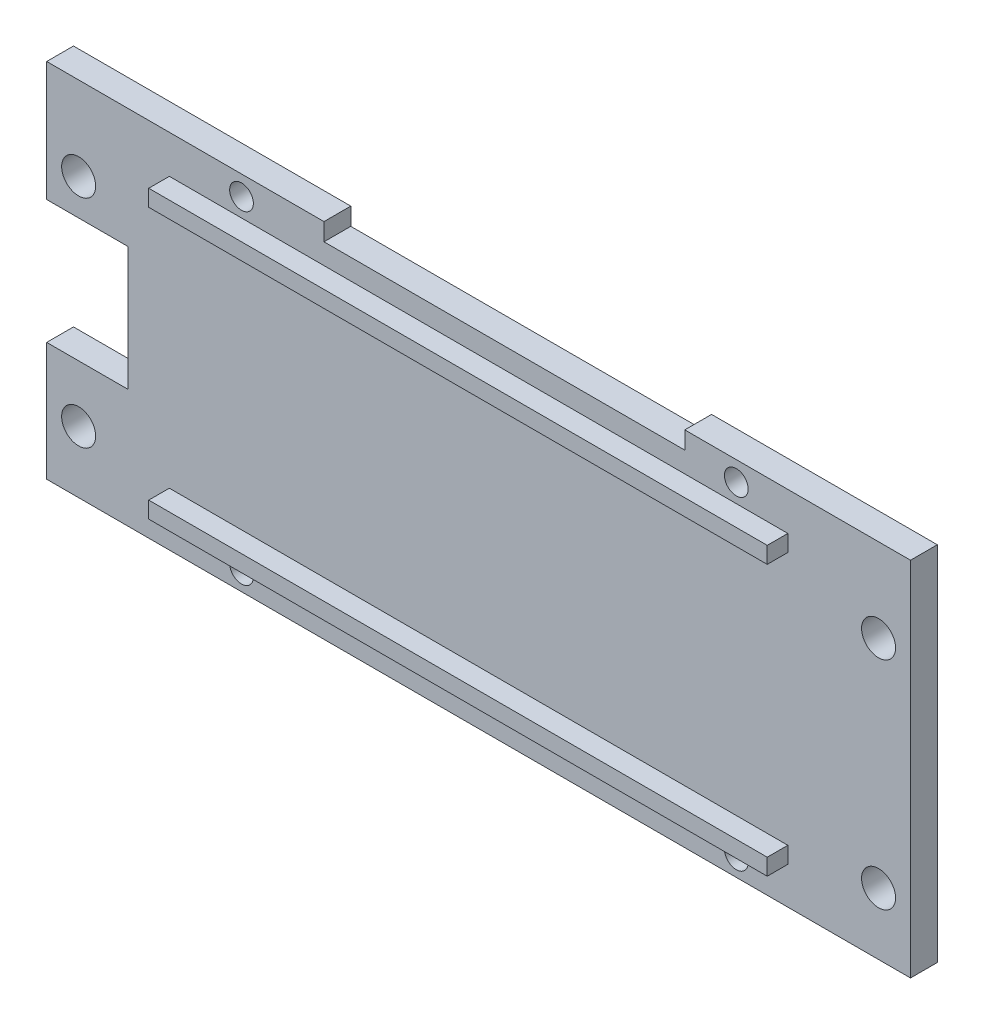
ISO-10303-21;
HEADER;
FILE_DESCRIPTION(('STEP AP214'),'2;1');
FILE_NAME('part.step','',(''),(''),'','','');
FILE_SCHEMA(('AUTOMOTIVE_DESIGN { 1 0 10303 214 1 1 1 1 }'));
ENDSEC;
DATA;
#1=APPLICATION_CONTEXT('core data for automotive mechanical design processes');
#2=APPLICATION_PROTOCOL_DEFINITION('international standard','automotive_design',2000,#1);
#3=PRODUCT_CONTEXT('',#1,'mechanical');
#4=PRODUCT('Part','Part','',(#3));
#5=PRODUCT_RELATED_PRODUCT_CATEGORY('part','',(#4));
#6=PRODUCT_DEFINITION_FORMATION('','',#4);
#7=PRODUCT_DEFINITION_CONTEXT('part definition',#1,'design');
#8=PRODUCT_DEFINITION('design','',#6,#7);
#9=PRODUCT_DEFINITION_SHAPE('','',#8);
#10=(LENGTH_UNIT() NAMED_UNIT(*) SI_UNIT(.MILLI.,.METRE.));
#11=(NAMED_UNIT(*) PLANE_ANGLE_UNIT() SI_UNIT($,.RADIAN.));
#12=(NAMED_UNIT(*) SI_UNIT($,.STERADIAN.) SOLID_ANGLE_UNIT());
#13=UNCERTAINTY_MEASURE_WITH_UNIT(LENGTH_MEASURE(1.E-05),#10,'distance_accuracy_value','');
#14=(GEOMETRIC_REPRESENTATION_CONTEXT(3) GLOBAL_UNCERTAINTY_ASSIGNED_CONTEXT((#13)) GLOBAL_UNIT_ASSIGNED_CONTEXT((#10,
#11,#12)) REPRESENTATION_CONTEXT('',''));
#15=CARTESIAN_POINT('',(0.,0.,0.));
#16=DIRECTION('',(0.,0.,1.));
#17=DIRECTION('',(1.,0.,0.));
#18=AXIS2_PLACEMENT_3D('',#15,#16,#17);
#19=CARTESIAN_POINT('',(0.,0.,2.6));
#20=DIRECTION('',(0.,0.,1.));
#21=DIRECTION('',(1.,0.,0.));
#22=AXIS2_PLACEMENT_3D('',#19,#20,#21);
#23=PLANE('',#22);
#24=CARTESIAN_POINT('',(-23.,8.7,2.6));
#25=DIRECTION('',(0.,0.,1.));
#26=DIRECTION('',(1.,0.,0.));
#27=AXIS2_PLACEMENT_3D('',#24,#25,#26);
#28=CIRCLE('',#27,1.15);
#29=CARTESIAN_POINT('',(-21.85,8.7,2.6));
#30=VERTEX_POINT('',#29);
#31=EDGE_CURVE('E246',#30,#30,#28,.T.);
#32=ORIENTED_EDGE('',*,*,#31,.F.);
#33=EDGE_LOOP('',(#32));
#34=FACE_BOUND('',#33,.T.);
#35=CARTESIAN_POINT('',(-23.,-22.7,2.6));
#36=DIRECTION('',(0.,0.,1.));
#37=DIRECTION('',(1.,0.,0.));
#38=AXIS2_PLACEMENT_3D('',#35,#36,#37);
#39=CIRCLE('',#38,1.15);
#40=CARTESIAN_POINT('',(-21.85,-22.7,2.6));
#41=VERTEX_POINT('',#40);
#42=EDGE_CURVE('E258',#41,#41,#39,.T.);
#43=ORIENTED_EDGE('',*,*,#42,.F.);
#44=EDGE_LOOP('',(#43));
#45=FACE_BOUND('',#44,.T.);
#46=CARTESIAN_POINT('',(-38.8,2.5,2.6));
#47=DIRECTION('',(0.,0.,1.));
#48=DIRECTION('',(1.,0.,0.));
#49=AXIS2_PLACEMENT_3D('',#46,#47,#48);
#50=CIRCLE('',#49,1.65);
#51=CARTESIAN_POINT('',(-37.15,2.5,2.6));
#52=VERTEX_POINT('',#51);
#53=EDGE_CURVE('E270',#52,#52,#50,.T.);
#54=ORIENTED_EDGE('',*,*,#53,.F.);
#55=EDGE_LOOP('',(#54));
#56=FACE_BOUND('',#55,.T.);
#57=CARTESIAN_POINT('',(-38.8,-18.5,2.6));
#58=DIRECTION('',(0.,0.,1.));
#59=DIRECTION('',(1.,0.,0.));
#60=AXIS2_PLACEMENT_3D('',#57,#58,#59);
#61=CIRCLE('',#60,1.65);
#62=CARTESIAN_POINT('',(-37.15,-18.5,2.6));
#63=VERTEX_POINT('',#62);
#64=EDGE_CURVE('E282',#63,#63,#61,.T.);
#65=ORIENTED_EDGE('',*,*,#64,.F.);
#66=EDGE_LOOP('',(#65));
#67=FACE_BOUND('',#66,.T.);
#68=DIRECTION('',(0.,-1.,0.));
#69=VECTOR('',#68,1.);
#70=CARTESIAN_POINT('',(-41.9,-13.,2.6));
#71=LINE('',#70,#69);
#72=CARTESIAN_POINT('',(-41.9,-13.,2.6));
#73=VERTEX_POINT('',#72);
#74=CARTESIAN_POINT('',(-41.9,-24.5,2.6));
#75=VERTEX_POINT('',#74);
#76=EDGE_CURVE('E288',#73,#75,#71,.T.);
#77=ORIENTED_EDGE('',*,*,#76,.T.);
#78=DIRECTION('',(1.,0.,0.));
#79=VECTOR('',#78,1.);
#80=CARTESIAN_POINT('',(-41.9,-24.5,2.6));
#81=LINE('',#80,#79);
#82=CARTESIAN_POINT('',(41.9,-24.5,2.6));
#83=VERTEX_POINT('',#82);
#84=EDGE_CURVE('E291',#75,#83,#81,.T.);
#85=ORIENTED_EDGE('',*,*,#84,.T.);
#86=DIRECTION('',(0.,1.,0.));
#87=VECTOR('',#86,1.);
#88=CARTESIAN_POINT('',(41.9,-24.5,2.6));
#89=LINE('',#88,#87);
#90=CARTESIAN_POINT('',(41.9,10.6,2.6));
#91=VERTEX_POINT('',#90);
#92=EDGE_CURVE('E294',#83,#91,#89,.T.);
#93=ORIENTED_EDGE('',*,*,#92,.T.);
#94=DIRECTION('',(-1.,0.,0.));
#95=VECTOR('',#94,1.);
#96=CARTESIAN_POINT('',(41.9,10.6,2.6));
#97=LINE('',#96,#95);
#98=CARTESIAN_POINT('',(20.,10.6,2.6));
#99=VERTEX_POINT('',#98);
#100=EDGE_CURVE('E296',#91,#99,#97,.T.);
#101=ORIENTED_EDGE('',*,*,#100,.T.);
#102=DIRECTION('',(0.,-1.,0.));
#103=VECTOR('',#102,1.);
#104=CARTESIAN_POINT('',(20.,10.6,2.6));
#105=LINE('',#104,#103);
#106=CARTESIAN_POINT('',(20.,8.9,2.6));
#107=VERTEX_POINT('',#106);
#108=EDGE_CURVE('E298',#99,#107,#105,.T.);
#109=ORIENTED_EDGE('',*,*,#108,.T.);
#110=DIRECTION('',(-1.,0.,0.));
#111=VECTOR('',#110,1.);
#112=CARTESIAN_POINT('',(20.,8.9,2.6));
#113=LINE('',#112,#111);
#114=CARTESIAN_POINT('',(-15.,8.9,2.6));
#115=VERTEX_POINT('',#114);
#116=EDGE_CURVE('E300',#107,#115,#113,.T.);
#117=ORIENTED_EDGE('',*,*,#116,.T.);
#118=DIRECTION('',(0.,1.,0.));
#119=VECTOR('',#118,1.);
#120=CARTESIAN_POINT('',(-15.,8.9,2.6));
#121=LINE('',#120,#119);
#122=CARTESIAN_POINT('',(-15.,10.6,2.6));
#123=VERTEX_POINT('',#122);
#124=EDGE_CURVE('E302',#115,#123,#121,.T.);
#125=ORIENTED_EDGE('',*,*,#124,.T.);
#126=DIRECTION('',(-1.,0.,0.));
#127=VECTOR('',#126,1.);
#128=CARTESIAN_POINT('',(-15.,10.6,2.6));
#129=LINE('',#128,#127);
#130=CARTESIAN_POINT('',(-41.9,10.6,2.6));
#131=VERTEX_POINT('',#130);
#132=EDGE_CURVE('E304',#123,#131,#129,.T.);
#133=ORIENTED_EDGE('',*,*,#132,.T.);
#134=DIRECTION('',(0.,-1.,0.));
#135=VECTOR('',#134,1.);
#136=CARTESIAN_POINT('',(-41.9,10.6,2.6));
#137=LINE('',#136,#135);
#138=CARTESIAN_POINT('',(-41.9,-1.,2.6));
#139=VERTEX_POINT('',#138);
#140=EDGE_CURVE('E306',#131,#139,#137,.T.);
#141=ORIENTED_EDGE('',*,*,#140,.T.);
#142=DIRECTION('',(1.,0.,0.));
#143=VECTOR('',#142,1.);
#144=CARTESIAN_POINT('',(-41.9,-1.,2.6));
#145=LINE('',#144,#143);
#146=CARTESIAN_POINT('',(-34.,-1.,2.6));
#147=VERTEX_POINT('',#146);
#148=EDGE_CURVE('E308',#139,#147,#145,.T.);
#149=ORIENTED_EDGE('',*,*,#148,.T.);
#150=DIRECTION('',(0.,-1.,0.));
#151=VECTOR('',#150,1.);
#152=CARTESIAN_POINT('',(-34.,-1.,2.6));
#153=LINE('',#152,#151);
#154=CARTESIAN_POINT('',(-34.,-13.,2.6));
#155=VERTEX_POINT('',#154);
#156=EDGE_CURVE('E310',#147,#155,#153,.T.);
#157=ORIENTED_EDGE('',*,*,#156,.T.);
#158=DIRECTION('',(-1.,0.,0.));
#159=VECTOR('',#158,1.);
#160=CARTESIAN_POINT('',(-34.,-13.,2.6));
#161=LINE('',#160,#159);
#162=EDGE_CURVE('E312',#155,#73,#161,.T.);
#163=ORIENTED_EDGE('',*,*,#162,.T.);
#164=EDGE_LOOP('',(#77,#85,#93,#101,#109,#117,#125,#133,#141,#149,#157,#163));
#165=FACE_BOUND('',#164,.T.);
#166=CARTESIAN_POINT('',(38.8,-18.5,2.6));
#167=DIRECTION('',(0.,0.,1.));
#168=DIRECTION('',(1.,0.,0.));
#169=AXIS2_PLACEMENT_3D('',#166,#167,#168);
#170=CIRCLE('',#169,1.65);
#171=CARTESIAN_POINT('',(40.45,-18.5,2.6));
#172=VERTEX_POINT('',#171);
#173=EDGE_CURVE('E276',#172,#172,#170,.T.);
#174=ORIENTED_EDGE('',*,*,#173,.F.);
#175=EDGE_LOOP('',(#174));
#176=FACE_BOUND('',#175,.T.);
#177=CARTESIAN_POINT('',(38.8,2.5,2.6));
#178=DIRECTION('',(0.,0.,1.));
#179=DIRECTION('',(1.,0.,0.));
#180=AXIS2_PLACEMENT_3D('',#177,#178,#179);
#181=CIRCLE('',#180,1.65);
#182=CARTESIAN_POINT('',(40.45,2.5,2.6));
#183=VERTEX_POINT('',#182);
#184=EDGE_CURVE('E264',#183,#183,#181,.T.);
#185=ORIENTED_EDGE('',*,*,#184,.F.);
#186=EDGE_LOOP('',(#185));
#187=FACE_BOUND('',#186,.T.);
#188=CARTESIAN_POINT('',(25.,-22.7,2.6));
#189=DIRECTION('',(0.,0.,1.));
#190=DIRECTION('',(1.,0.,0.));
#191=AXIS2_PLACEMENT_3D('',#188,#189,#190);
#192=CIRCLE('',#191,1.15);
#193=CARTESIAN_POINT('',(26.15,-22.7,2.6));
#194=VERTEX_POINT('',#193);
#195=EDGE_CURVE('E252',#194,#194,#192,.T.);
#196=ORIENTED_EDGE('',*,*,#195,.F.);
#197=EDGE_LOOP('',(#196));
#198=FACE_BOUND('',#197,.T.);
#199=CARTESIAN_POINT('',(25.,8.7,2.6));
#200=DIRECTION('',(0.,0.,1.));
#201=DIRECTION('',(1.,0.,0.));
#202=AXIS2_PLACEMENT_3D('',#199,#200,#201);
#203=CIRCLE('',#202,1.15);
#204=CARTESIAN_POINT('',(26.15,8.7,2.6));
#205=VERTEX_POINT('',#204);
#206=EDGE_CURVE('E240',#205,#205,#203,.T.);
#207=ORIENTED_EDGE('',*,*,#206,.F.);
#208=EDGE_LOOP('',(#207));
#209=FACE_BOUND('',#208,.T.);
#210=DIRECTION('',(1.,0.,0.));
#211=VECTOR('',#210,1.);
#212=CARTESIAN_POINT('',(-30.,-20.9,2.6));
#213=LINE('',#212,#211);
#214=CARTESIAN_POINT('',(-30.,-20.9,2.6));
#215=VERTEX_POINT('',#214);
#216=CARTESIAN_POINT('',(30.,-20.9,2.6));
#217=VERTEX_POINT('',#216);
#218=EDGE_CURVE('E205',#215,#217,#213,.T.);
#219=ORIENTED_EDGE('',*,*,#218,.F.);
#220=DIRECTION('',(0.,-1.,0.));
#221=VECTOR('',#220,1.);
#222=CARTESIAN_POINT('',(-30.,-19.3,2.6));
#223=LINE('',#222,#221);
#224=CARTESIAN_POINT('',(-30.,-19.3,2.6));
#225=VERTEX_POINT('',#224);
#226=EDGE_CURVE('E202',#225,#215,#223,.T.);
#227=ORIENTED_EDGE('',*,*,#226,.F.);
#228=DIRECTION('',(-1.,0.,0.));
#229=VECTOR('',#228,1.);
#230=CARTESIAN_POINT('',(30.,-19.3,2.6));
#231=LINE('',#230,#229);
#232=CARTESIAN_POINT('',(30.,-19.3,2.6));
#233=VERTEX_POINT('',#232);
#234=EDGE_CURVE('E220',#233,#225,#231,.T.);
#235=ORIENTED_EDGE('',*,*,#234,.F.);
#236=DIRECTION('',(0.,1.,0.));
#237=VECTOR('',#236,1.);
#238=CARTESIAN_POINT('',(30.,-20.9,2.6));
#239=LINE('',#238,#237);
#240=EDGE_CURVE('E228',#217,#233,#239,.T.);
#241=ORIENTED_EDGE('',*,*,#240,.F.);
#242=EDGE_LOOP('',(#219,#227,#235,#241));
#243=FACE_BOUND('',#242,.T.);
#244=DIRECTION('',(1.,0.,0.));
#245=VECTOR('',#244,1.);
#246=CARTESIAN_POINT('',(-30.,5.3,2.6));
#247=LINE('',#246,#245);
#248=CARTESIAN_POINT('',(-30.,5.3,2.6));
#249=VERTEX_POINT('',#248);
#250=CARTESIAN_POINT('',(30.,5.3,2.6));
#251=VERTEX_POINT('',#250);
#252=EDGE_CURVE('E201',#249,#251,#247,.T.);
#253=ORIENTED_EDGE('',*,*,#252,.F.);
#254=DIRECTION('',(0.,-1.,0.));
#255=VECTOR('',#254,1.);
#256=CARTESIAN_POINT('',(-30.,6.9,2.6));
#257=LINE('',#256,#255);
#258=CARTESIAN_POINT('',(-30.,6.9,2.6));
#259=VERTEX_POINT('',#258);
#260=EDGE_CURVE('E196',#259,#249,#257,.T.);
#261=ORIENTED_EDGE('',*,*,#260,.F.);
#262=DIRECTION('',(-1.,0.,0.));
#263=VECTOR('',#262,1.);
#264=CARTESIAN_POINT('',(30.,6.9,2.6));
#265=LINE('',#264,#263);
#266=CARTESIAN_POINT('',(30.,6.9,2.6));
#267=VERTEX_POINT('',#266);
#268=EDGE_CURVE('E181',#267,#259,#265,.T.);
#269=ORIENTED_EDGE('',*,*,#268,.F.);
#270=DIRECTION('',(0.,1.,0.));
#271=VECTOR('',#270,1.);
#272=CARTESIAN_POINT('',(30.,5.3,2.6));
#273=LINE('',#272,#271);
#274=EDGE_CURVE('E189',#251,#267,#273,.T.);
#275=ORIENTED_EDGE('',*,*,#274,.F.);
#276=EDGE_LOOP('',(#253,#261,#269,#275));
#277=FACE_BOUND('',#276,.T.);
#278=ADVANCED_FACE('F43',(#34,#45,#56,#67,#165,#176,#187,#198,#209,#243,#277),#23,.T.);
#279=CARTESIAN_POINT('',(0.,0.,0.));
#280=DIRECTION('',(0.,0.,1.));
#281=DIRECTION('',(1.,0.,0.));
#282=AXIS2_PLACEMENT_3D('',#279,#280,#281);
#283=PLANE('',#282);
#284=DIRECTION('',(0.,-1.,0.));
#285=VECTOR('',#284,1.);
#286=CARTESIAN_POINT('',(-41.9,-13.,0.));
#287=LINE('',#286,#285);
#288=CARTESIAN_POINT('',(-41.9,-13.,0.));
#289=VERTEX_POINT('',#288);
#290=CARTESIAN_POINT('',(-41.9,-24.5,0.));
#291=VERTEX_POINT('',#290);
#292=EDGE_CURVE('E285',#289,#291,#287,.T.);
#293=ORIENTED_EDGE('',*,*,#292,.F.);
#294=DIRECTION('',(-1.,0.,0.));
#295=VECTOR('',#294,1.);
#296=CARTESIAN_POINT('',(-34.,-13.,0.));
#297=LINE('',#296,#295);
#298=CARTESIAN_POINT('',(-34.,-13.,0.));
#299=VERTEX_POINT('',#298);
#300=EDGE_CURVE('E292',#299,#289,#297,.T.);
#301=ORIENTED_EDGE('',*,*,#300,.F.);
#302=DIRECTION('',(0.,-1.,0.));
#303=VECTOR('',#302,1.);
#304=CARTESIAN_POINT('',(-34.,-1.,0.));
#305=LINE('',#304,#303);
#306=CARTESIAN_POINT('',(-34.,-1.,0.));
#307=VERTEX_POINT('',#306);
#308=EDGE_CURVE('E335',#307,#299,#305,.T.);
#309=ORIENTED_EDGE('',*,*,#308,.F.);
#310=DIRECTION('',(1.,0.,0.));
#311=VECTOR('',#310,1.);
#312=CARTESIAN_POINT('',(-41.9,-1.,0.));
#313=LINE('',#312,#311);
#314=CARTESIAN_POINT('',(-41.9,-1.,0.));
#315=VERTEX_POINT('',#314);
#316=EDGE_CURVE('E333',#315,#307,#313,.T.);
#317=ORIENTED_EDGE('',*,*,#316,.F.);
#318=DIRECTION('',(0.,-1.,0.));
#319=VECTOR('',#318,1.);
#320=CARTESIAN_POINT('',(-41.9,10.6,0.));
#321=LINE('',#320,#319);
#322=CARTESIAN_POINT('',(-41.9,10.6,0.));
#323=VERTEX_POINT('',#322);
#324=EDGE_CURVE('E331',#323,#315,#321,.T.);
#325=ORIENTED_EDGE('',*,*,#324,.F.);
#326=DIRECTION('',(-1.,0.,0.));
#327=VECTOR('',#326,1.);
#328=CARTESIAN_POINT('',(-15.,10.6,0.));
#329=LINE('',#328,#327);
#330=CARTESIAN_POINT('',(-15.,10.6,0.));
#331=VERTEX_POINT('',#330);
#332=EDGE_CURVE('E329',#331,#323,#329,.T.);
#333=ORIENTED_EDGE('',*,*,#332,.F.);
#334=DIRECTION('',(0.,1.,0.));
#335=VECTOR('',#334,1.);
#336=CARTESIAN_POINT('',(-15.,8.9,0.));
#337=LINE('',#336,#335);
#338=CARTESIAN_POINT('',(-15.,8.9,0.));
#339=VERTEX_POINT('',#338);
#340=EDGE_CURVE('E327',#339,#331,#337,.T.);
#341=ORIENTED_EDGE('',*,*,#340,.F.);
#342=DIRECTION('',(-1.,0.,0.));
#343=VECTOR('',#342,1.);
#344=CARTESIAN_POINT('',(20.,8.9,0.));
#345=LINE('',#344,#343);
#346=CARTESIAN_POINT('',(20.,8.9,0.));
#347=VERTEX_POINT('',#346);
#348=EDGE_CURVE('E325',#347,#339,#345,.T.);
#349=ORIENTED_EDGE('',*,*,#348,.F.);
#350=DIRECTION('',(0.,-1.,0.));
#351=VECTOR('',#350,1.);
#352=CARTESIAN_POINT('',(20.,10.6,0.));
#353=LINE('',#352,#351);
#354=CARTESIAN_POINT('',(20.,10.6,0.));
#355=VERTEX_POINT('',#354);
#356=EDGE_CURVE('E323',#355,#347,#353,.T.);
#357=ORIENTED_EDGE('',*,*,#356,.F.);
#358=DIRECTION('',(-1.,0.,0.));
#359=VECTOR('',#358,1.);
#360=CARTESIAN_POINT('',(41.9,10.6,0.));
#361=LINE('',#360,#359);
#362=CARTESIAN_POINT('',(41.9,10.6,0.));
#363=VERTEX_POINT('',#362);
#364=EDGE_CURVE('E321',#363,#355,#361,.T.);
#365=ORIENTED_EDGE('',*,*,#364,.F.);
#366=DIRECTION('',(0.,1.,0.));
#367=VECTOR('',#366,1.);
#368=CARTESIAN_POINT('',(41.9,-24.5,0.));
#369=LINE('',#368,#367);
#370=CARTESIAN_POINT('',(41.9,-24.5,0.));
#371=VERTEX_POINT('',#370);
#372=EDGE_CURVE('E319',#371,#363,#369,.T.);
#373=ORIENTED_EDGE('',*,*,#372,.F.);
#374=DIRECTION('',(1.,0.,0.));
#375=VECTOR('',#374,1.);
#376=CARTESIAN_POINT('',(-41.9,-24.5,0.));
#377=LINE('',#376,#375);
#378=EDGE_CURVE('E317',#291,#371,#377,.T.);
#379=ORIENTED_EDGE('',*,*,#378,.F.);
#380=EDGE_LOOP('',(#293,#301,#309,#317,#325,#333,#341,#349,#357,#365,#373,#379));
#381=FACE_BOUND('',#380,.T.);
#382=CARTESIAN_POINT('',(-38.8,-18.5,0.));
#383=DIRECTION('',(0.,0.,1.));
#384=DIRECTION('',(1.,0.,0.));
#385=AXIS2_PLACEMENT_3D('',#382,#383,#384);
#386=CIRCLE('',#385,1.65);
#387=CARTESIAN_POINT('',(-37.15,-18.5,0.));
#388=VERTEX_POINT('',#387);
#389=EDGE_CURVE('E279',#388,#388,#386,.T.);
#390=ORIENTED_EDGE('',*,*,#389,.T.);
#391=EDGE_LOOP('',(#390));
#392=FACE_BOUND('',#391,.T.);
#393=CARTESIAN_POINT('',(38.8,-18.5,0.));
#394=DIRECTION('',(0.,0.,1.));
#395=DIRECTION('',(1.,0.,0.));
#396=AXIS2_PLACEMENT_3D('',#393,#394,#395);
#397=CIRCLE('',#396,1.65);
#398=CARTESIAN_POINT('',(40.45,-18.5,0.));
#399=VERTEX_POINT('',#398);
#400=EDGE_CURVE('E273',#399,#399,#397,.T.);
#401=ORIENTED_EDGE('',*,*,#400,.T.);
#402=EDGE_LOOP('',(#401));
#403=FACE_BOUND('',#402,.T.);
#404=CARTESIAN_POINT('',(-38.8,2.5,0.));
#405=DIRECTION('',(0.,0.,1.));
#406=DIRECTION('',(1.,0.,0.));
#407=AXIS2_PLACEMENT_3D('',#404,#405,#406);
#408=CIRCLE('',#407,1.65);
#409=CARTESIAN_POINT('',(-37.15,2.5,0.));
#410=VERTEX_POINT('',#409);
#411=EDGE_CURVE('E267',#410,#410,#408,.T.);
#412=ORIENTED_EDGE('',*,*,#411,.T.);
#413=EDGE_LOOP('',(#412));
#414=FACE_BOUND('',#413,.T.);
#415=CARTESIAN_POINT('',(38.8,2.5,0.));
#416=DIRECTION('',(0.,0.,1.));
#417=DIRECTION('',(1.,0.,0.));
#418=AXIS2_PLACEMENT_3D('',#415,#416,#417);
#419=CIRCLE('',#418,1.65);
#420=CARTESIAN_POINT('',(40.45,2.5,0.));
#421=VERTEX_POINT('',#420);
#422=EDGE_CURVE('E261',#421,#421,#419,.T.);
#423=ORIENTED_EDGE('',*,*,#422,.T.);
#424=EDGE_LOOP('',(#423));
#425=FACE_BOUND('',#424,.T.);
#426=CARTESIAN_POINT('',(-23.,-22.7,0.));
#427=DIRECTION('',(0.,0.,1.));
#428=DIRECTION('',(1.,0.,0.));
#429=AXIS2_PLACEMENT_3D('',#426,#427,#428);
#430=CIRCLE('',#429,1.15);
#431=CARTESIAN_POINT('',(-21.85,-22.7,0.));
#432=VERTEX_POINT('',#431);
#433=EDGE_CURVE('E255',#432,#432,#430,.T.);
#434=ORIENTED_EDGE('',*,*,#433,.T.);
#435=EDGE_LOOP('',(#434));
#436=FACE_BOUND('',#435,.T.);
#437=CARTESIAN_POINT('',(25.,-22.7,0.));
#438=DIRECTION('',(0.,0.,1.));
#439=DIRECTION('',(1.,0.,0.));
#440=AXIS2_PLACEMENT_3D('',#437,#438,#439);
#441=CIRCLE('',#440,1.15);
#442=CARTESIAN_POINT('',(26.15,-22.7,0.));
#443=VERTEX_POINT('',#442);
#444=EDGE_CURVE('E249',#443,#443,#441,.T.);
#445=ORIENTED_EDGE('',*,*,#444,.T.);
#446=EDGE_LOOP('',(#445));
#447=FACE_BOUND('',#446,.T.);
#448=CARTESIAN_POINT('',(-23.,8.7,0.));
#449=DIRECTION('',(0.,0.,1.));
#450=DIRECTION('',(1.,0.,0.));
#451=AXIS2_PLACEMENT_3D('',#448,#449,#450);
#452=CIRCLE('',#451,1.15);
#453=CARTESIAN_POINT('',(-21.85,8.7,0.));
#454=VERTEX_POINT('',#453);
#455=EDGE_CURVE('E243',#454,#454,#452,.T.);
#456=ORIENTED_EDGE('',*,*,#455,.T.);
#457=EDGE_LOOP('',(#456));
#458=FACE_BOUND('',#457,.T.);
#459=CARTESIAN_POINT('',(25.,8.7,0.));
#460=DIRECTION('',(0.,0.,1.));
#461=DIRECTION('',(1.,0.,0.));
#462=AXIS2_PLACEMENT_3D('',#459,#460,#461);
#463=CIRCLE('',#462,1.15);
#464=CARTESIAN_POINT('',(26.15,8.7,0.));
#465=VERTEX_POINT('',#464);
#466=EDGE_CURVE('E239',#465,#465,#463,.T.);
#467=ORIENTED_EDGE('',*,*,#466,.T.);
#468=EDGE_LOOP('',(#467));
#469=FACE_BOUND('',#468,.T.);
#470=ADVANCED_FACE('F377',(#381,#392,#403,#414,#425,#436,#447,#458,#469),#283,.F.);
#471=CARTESIAN_POINT('',(-41.9,-13.,2.6));
#472=DIRECTION('',(1.,0.,0.));
#473=DIRECTION('',(0.,0.,-1.));
#474=AXIS2_PLACEMENT_3D('',#471,#472,#473);
#475=PLANE('',#474);
#476=ORIENTED_EDGE('',*,*,#292,.T.);
#477=DIRECTION('',(0.,0.,-1.));
#478=VECTOR('',#477,1.);
#479=CARTESIAN_POINT('',(-41.9,-24.5,2.6));
#480=LINE('',#479,#478);
#481=EDGE_CURVE('E11',#75,#291,#480,.T.);
#482=ORIENTED_EDGE('',*,*,#481,.F.);
#483=ORIENTED_EDGE('',*,*,#76,.F.);
#484=DIRECTION('',(0.,0.,-1.));
#485=VECTOR('',#484,1.);
#486=CARTESIAN_POINT('',(-41.9,-13.,2.6));
#487=LINE('',#486,#485);
#488=EDGE_CURVE('E314',#73,#289,#487,.T.);
#489=ORIENTED_EDGE('',*,*,#488,.T.);
#490=EDGE_LOOP('',(#476,#482,#483,#489));
#491=FACE_BOUND('',#490,.T.);
#492=ADVANCED_FACE('F45',(#491),#475,.F.);
#493=CARTESIAN_POINT('',(-41.9,-24.5,2.6));
#494=DIRECTION('',(0.,1.,0.));
#495=DIRECTION('',(0.,0.,1.));
#496=AXIS2_PLACEMENT_3D('',#493,#494,#495);
#497=PLANE('',#496);
#498=ORIENTED_EDGE('',*,*,#378,.T.);
#499=DIRECTION('',(0.,0.,-1.));
#500=VECTOR('',#499,1.);
#501=CARTESIAN_POINT('',(41.9,-24.5,2.6));
#502=LINE('',#501,#500);
#503=EDGE_CURVE('E51',#83,#371,#502,.T.);
#504=ORIENTED_EDGE('',*,*,#503,.F.);
#505=ORIENTED_EDGE('',*,*,#84,.F.);
#506=ORIENTED_EDGE('',*,*,#481,.T.);
#507=EDGE_LOOP('',(#498,#504,#505,#506));
#508=FACE_BOUND('',#507,.T.);
#509=ADVANCED_FACE('F395',(#508),#497,.F.);
#510=CARTESIAN_POINT('',(41.9,-24.5,2.6));
#511=DIRECTION('',(-1.,0.,0.));
#512=DIRECTION('',(0.,0.,1.));
#513=AXIS2_PLACEMENT_3D('',#510,#511,#512);
#514=PLANE('',#513);
#515=ORIENTED_EDGE('',*,*,#372,.T.);
#516=DIRECTION('',(0.,0.,-1.));
#517=VECTOR('',#516,1.);
#518=CARTESIAN_POINT('',(41.9,10.6,2.6));
#519=LINE('',#518,#517);
#520=EDGE_CURVE('E364',#91,#363,#519,.T.);
#521=ORIENTED_EDGE('',*,*,#520,.F.);
#522=ORIENTED_EDGE('',*,*,#92,.F.);
#523=ORIENTED_EDGE('',*,*,#503,.T.);
#524=EDGE_LOOP('',(#515,#521,#522,#523));
#525=FACE_BOUND('',#524,.T.);
#526=ADVANCED_FACE('F371',(#525),#514,.F.);
#527=CARTESIAN_POINT('',(41.9,10.6,2.6));
#528=DIRECTION('',(0.,-1.,0.));
#529=DIRECTION('',(0.,0.,-1.));
#530=AXIS2_PLACEMENT_3D('',#527,#528,#529);
#531=PLANE('',#530);
#532=ORIENTED_EDGE('',*,*,#364,.T.);
#533=DIRECTION('',(0.,0.,-1.));
#534=VECTOR('',#533,1.);
#535=CARTESIAN_POINT('',(20.,10.6,2.6));
#536=LINE('',#535,#534);
#537=EDGE_CURVE('E361',#99,#355,#536,.T.);
#538=ORIENTED_EDGE('',*,*,#537,.F.);
#539=ORIENTED_EDGE('',*,*,#100,.F.);
#540=ORIENTED_EDGE('',*,*,#520,.T.);
#541=EDGE_LOOP('',(#532,#538,#539,#540));
#542=FACE_BOUND('',#541,.T.);
#543=ADVANCED_FACE('F383',(#542),#531,.F.);
#544=CARTESIAN_POINT('',(20.,10.6,2.6));
#545=DIRECTION('',(1.,0.,0.));
#546=DIRECTION('',(0.,0.,-1.));
#547=AXIS2_PLACEMENT_3D('',#544,#545,#546);
#548=PLANE('',#547);
#549=ORIENTED_EDGE('',*,*,#356,.T.);
#550=DIRECTION('',(0.,0.,-1.));
#551=VECTOR('',#550,1.);
#552=CARTESIAN_POINT('',(20.,8.9,2.6));
#553=LINE('',#552,#551);
#554=EDGE_CURVE('E358',#107,#347,#553,.T.);
#555=ORIENTED_EDGE('',*,*,#554,.F.);
#556=ORIENTED_EDGE('',*,*,#108,.F.);
#557=ORIENTED_EDGE('',*,*,#537,.T.);
#558=EDGE_LOOP('',(#549,#555,#556,#557));
#559=FACE_BOUND('',#558,.T.);
#560=ADVANCED_FACE('F387',(#559),#548,.F.);
#561=CARTESIAN_POINT('',(20.,8.9,2.6));
#562=DIRECTION('',(0.,-1.,0.));
#563=DIRECTION('',(0.,0.,-1.));
#564=AXIS2_PLACEMENT_3D('',#561,#562,#563);
#565=PLANE('',#564);
#566=ORIENTED_EDGE('',*,*,#348,.T.);
#567=DIRECTION('',(0.,0.,-1.));
#568=VECTOR('',#567,1.);
#569=CARTESIAN_POINT('',(-15.,8.9,2.6));
#570=LINE('',#569,#568);
#571=EDGE_CURVE('E355',#115,#339,#570,.T.);
#572=ORIENTED_EDGE('',*,*,#571,.F.);
#573=ORIENTED_EDGE('',*,*,#116,.F.);
#574=ORIENTED_EDGE('',*,*,#554,.T.);
#575=EDGE_LOOP('',(#566,#572,#573,#574));
#576=FACE_BOUND('',#575,.T.);
#577=ADVANCED_FACE('F428',(#576),#565,.F.);
#578=CARTESIAN_POINT('',(-15.,8.9,2.6));
#579=DIRECTION('',(-1.,0.,0.));
#580=DIRECTION('',(0.,0.,1.));
#581=AXIS2_PLACEMENT_3D('',#578,#579,#580);
#582=PLANE('',#581);
#583=ORIENTED_EDGE('',*,*,#340,.T.);
#584=DIRECTION('',(0.,0.,-1.));
#585=VECTOR('',#584,1.);
#586=CARTESIAN_POINT('',(-15.,10.6,2.6));
#587=LINE('',#586,#585);
#588=EDGE_CURVE('E352',#123,#331,#587,.T.);
#589=ORIENTED_EDGE('',*,*,#588,.F.);
#590=ORIENTED_EDGE('',*,*,#124,.F.);
#591=ORIENTED_EDGE('',*,*,#571,.T.);
#592=EDGE_LOOP('',(#583,#589,#590,#591));
#593=FACE_BOUND('',#592,.T.);
#594=ADVANCED_FACE('F426',(#593),#582,.F.);
#595=CARTESIAN_POINT('',(-15.,10.6,2.6));
#596=DIRECTION('',(0.,-1.,0.));
#597=DIRECTION('',(0.,0.,-1.));
#598=AXIS2_PLACEMENT_3D('',#595,#596,#597);
#599=PLANE('',#598);
#600=ORIENTED_EDGE('',*,*,#332,.T.);
#601=DIRECTION('',(0.,0.,-1.));
#602=VECTOR('',#601,1.);
#603=CARTESIAN_POINT('',(-41.9,10.6,2.6));
#604=LINE('',#603,#602);
#605=EDGE_CURVE('E349',#131,#323,#604,.T.);
#606=ORIENTED_EDGE('',*,*,#605,.F.);
#607=ORIENTED_EDGE('',*,*,#132,.F.);
#608=ORIENTED_EDGE('',*,*,#588,.T.);
#609=EDGE_LOOP('',(#600,#606,#607,#608));
#610=FACE_BOUND('',#609,.T.);
#611=ADVANCED_FACE('F422',(#610),#599,.F.);
#612=CARTESIAN_POINT('',(-41.9,10.6,2.6));
#613=DIRECTION('',(1.,0.,0.));
#614=DIRECTION('',(0.,0.,-1.));
#615=AXIS2_PLACEMENT_3D('',#612,#613,#614);
#616=PLANE('',#615);
#617=ORIENTED_EDGE('',*,*,#324,.T.);
#618=DIRECTION('',(0.,0.,-1.));
#619=VECTOR('',#618,1.);
#620=CARTESIAN_POINT('',(-41.9,-1.,2.6));
#621=LINE('',#620,#619);
#622=EDGE_CURVE('E346',#139,#315,#621,.T.);
#623=ORIENTED_EDGE('',*,*,#622,.F.);
#624=ORIENTED_EDGE('',*,*,#140,.F.);
#625=ORIENTED_EDGE('',*,*,#605,.T.);
#626=EDGE_LOOP('',(#617,#623,#624,#625));
#627=FACE_BOUND('',#626,.T.);
#628=ADVANCED_FACE('F417',(#627),#616,.F.);
#629=CARTESIAN_POINT('',(-41.9,-1.,2.6));
#630=DIRECTION('',(0.,1.,0.));
#631=DIRECTION('',(0.,0.,1.));
#632=AXIS2_PLACEMENT_3D('',#629,#630,#631);
#633=PLANE('',#632);
#634=ORIENTED_EDGE('',*,*,#316,.T.);
#635=DIRECTION('',(0.,0.,-1.));
#636=VECTOR('',#635,1.);
#637=CARTESIAN_POINT('',(-34.,-1.,2.6));
#638=LINE('',#637,#636);
#639=EDGE_CURVE('E343',#147,#307,#638,.T.);
#640=ORIENTED_EDGE('',*,*,#639,.F.);
#641=ORIENTED_EDGE('',*,*,#148,.F.);
#642=ORIENTED_EDGE('',*,*,#622,.T.);
#643=EDGE_LOOP('',(#634,#640,#641,#642));
#644=FACE_BOUND('',#643,.T.);
#645=ADVANCED_FACE('F411',(#644),#633,.F.);
#646=CARTESIAN_POINT('',(-34.,-1.,2.6));
#647=DIRECTION('',(1.,0.,0.));
#648=DIRECTION('',(0.,0.,-1.));
#649=AXIS2_PLACEMENT_3D('',#646,#647,#648);
#650=PLANE('',#649);
#651=ORIENTED_EDGE('',*,*,#308,.T.);
#652=DIRECTION('',(0.,0.,-1.));
#653=VECTOR('',#652,1.);
#654=CARTESIAN_POINT('',(-34.,-13.,2.6));
#655=LINE('',#654,#653);
#656=EDGE_CURVE('E340',#155,#299,#655,.T.);
#657=ORIENTED_EDGE('',*,*,#656,.F.);
#658=ORIENTED_EDGE('',*,*,#156,.F.);
#659=ORIENTED_EDGE('',*,*,#639,.T.);
#660=EDGE_LOOP('',(#651,#657,#658,#659));
#661=FACE_BOUND('',#660,.T.);
#662=ADVANCED_FACE('F407',(#661),#650,.F.);
#663=CARTESIAN_POINT('',(-34.,-13.,2.6));
#664=DIRECTION('',(0.,-1.,0.));
#665=DIRECTION('',(0.,0.,-1.));
#666=AXIS2_PLACEMENT_3D('',#663,#664,#665);
#667=PLANE('',#666);
#668=ORIENTED_EDGE('',*,*,#300,.T.);
#669=ORIENTED_EDGE('',*,*,#488,.F.);
#670=ORIENTED_EDGE('',*,*,#162,.F.);
#671=ORIENTED_EDGE('',*,*,#656,.T.);
#672=EDGE_LOOP('',(#668,#669,#670,#671));
#673=FACE_BOUND('',#672,.T.);
#674=ADVANCED_FACE('F402',(#673),#667,.F.);
#675=CARTESIAN_POINT('',(-38.8,-18.5,2.6));
#676=DIRECTION('',(0.,0.,-1.));
#677=DIRECTION('',(-1.,0.,0.));
#678=AXIS2_PLACEMENT_3D('',#675,#676,#677);
#679=CYLINDRICAL_SURFACE('',#678,1.65);
#680=ORIENTED_EDGE('',*,*,#64,.T.);
#681=EDGE_LOOP('',(#680));
#682=FACE_BOUND('',#681,.T.);
#683=ORIENTED_EDGE('',*,*,#389,.F.);
#684=EDGE_LOOP('',(#683));
#685=FACE_BOUND('',#684,.T.);
#686=ADVANCED_FACE('F449',(#682,#685),#679,.F.);
#687=CARTESIAN_POINT('',(38.8,-18.5,2.6));
#688=DIRECTION('',(0.,0.,-1.));
#689=DIRECTION('',(-1.,0.,0.));
#690=AXIS2_PLACEMENT_3D('',#687,#688,#689);
#691=CYLINDRICAL_SURFACE('',#690,1.65);
#692=ORIENTED_EDGE('',*,*,#173,.T.);
#693=EDGE_LOOP('',(#692));
#694=FACE_BOUND('',#693,.T.);
#695=ORIENTED_EDGE('',*,*,#400,.F.);
#696=EDGE_LOOP('',(#695));
#697=FACE_BOUND('',#696,.T.);
#698=ADVANCED_FACE('F492',(#694,#697),#691,.F.);
#699=CARTESIAN_POINT('',(-38.8,2.5,2.6));
#700=DIRECTION('',(0.,0.,-1.));
#701=DIRECTION('',(-1.,0.,0.));
#702=AXIS2_PLACEMENT_3D('',#699,#700,#701);
#703=CYLINDRICAL_SURFACE('',#702,1.65);
#704=ORIENTED_EDGE('',*,*,#53,.T.);
#705=EDGE_LOOP('',(#704));
#706=FACE_BOUND('',#705,.T.);
#707=ORIENTED_EDGE('',*,*,#411,.F.);
#708=EDGE_LOOP('',(#707));
#709=FACE_BOUND('',#708,.T.);
#710=ADVANCED_FACE('F500',(#706,#709),#703,.F.);
#711=CARTESIAN_POINT('',(38.8,2.5,2.6));
#712=DIRECTION('',(0.,0.,-1.));
#713=DIRECTION('',(-1.,0.,0.));
#714=AXIS2_PLACEMENT_3D('',#711,#712,#713);
#715=CYLINDRICAL_SURFACE('',#714,1.65);
#716=ORIENTED_EDGE('',*,*,#184,.T.);
#717=EDGE_LOOP('',(#716));
#718=FACE_BOUND('',#717,.T.);
#719=ORIENTED_EDGE('',*,*,#422,.F.);
#720=EDGE_LOOP('',(#719));
#721=FACE_BOUND('',#720,.T.);
#722=ADVANCED_FACE('F508',(#718,#721),#715,.F.);
#723=CARTESIAN_POINT('',(-23.,-22.7,2.6));
#724=DIRECTION('',(0.,0.,-1.));
#725=DIRECTION('',(-1.,0.,0.));
#726=AXIS2_PLACEMENT_3D('',#723,#724,#725);
#727=CYLINDRICAL_SURFACE('',#726,1.15);
#728=ORIENTED_EDGE('',*,*,#42,.T.);
#729=EDGE_LOOP('',(#728));
#730=FACE_BOUND('',#729,.T.);
#731=ORIENTED_EDGE('',*,*,#433,.F.);
#732=EDGE_LOOP('',(#731));
#733=FACE_BOUND('',#732,.T.);
#734=ADVANCED_FACE('F517',(#730,#733),#727,.F.);
#735=CARTESIAN_POINT('',(25.,-22.7,2.6));
#736=DIRECTION('',(0.,0.,-1.));
#737=DIRECTION('',(-1.,0.,0.));
#738=AXIS2_PLACEMENT_3D('',#735,#736,#737);
#739=CYLINDRICAL_SURFACE('',#738,1.15);
#740=ORIENTED_EDGE('',*,*,#195,.T.);
#741=EDGE_LOOP('',(#740));
#742=FACE_BOUND('',#741,.T.);
#743=ORIENTED_EDGE('',*,*,#444,.F.);
#744=EDGE_LOOP('',(#743));
#745=FACE_BOUND('',#744,.T.);
#746=ADVANCED_FACE('F526',(#742,#745),#739,.F.);
#747=CARTESIAN_POINT('',(-23.,8.7,2.6));
#748=DIRECTION('',(0.,0.,-1.));
#749=DIRECTION('',(-1.,0.,0.));
#750=AXIS2_PLACEMENT_3D('',#747,#748,#749);
#751=CYLINDRICAL_SURFACE('',#750,1.15);
#752=ORIENTED_EDGE('',*,*,#31,.T.);
#753=EDGE_LOOP('',(#752));
#754=FACE_BOUND('',#753,.T.);
#755=ORIENTED_EDGE('',*,*,#455,.F.);
#756=EDGE_LOOP('',(#755));
#757=FACE_BOUND('',#756,.T.);
#758=ADVANCED_FACE('F535',(#754,#757),#751,.F.);
#759=CARTESIAN_POINT('',(25.,8.7,2.6));
#760=DIRECTION('',(0.,0.,-1.));
#761=DIRECTION('',(-1.,0.,0.));
#762=AXIS2_PLACEMENT_3D('',#759,#760,#761);
#763=CYLINDRICAL_SURFACE('',#762,1.15);
#764=ORIENTED_EDGE('',*,*,#206,.T.);
#765=EDGE_LOOP('',(#764));
#766=FACE_BOUND('',#765,.T.);
#767=ORIENTED_EDGE('',*,*,#466,.F.);
#768=EDGE_LOOP('',(#767));
#769=FACE_BOUND('',#768,.T.);
#770=ADVANCED_FACE('F543',(#766,#769),#763,.F.);
#771=CARTESIAN_POINT('',(-30.,-19.3,4.6));
#772=DIRECTION('',(1.,0.,0.));
#773=DIRECTION('',(0.,0.,-1.));
#774=AXIS2_PLACEMENT_3D('',#771,#772,#773);
#775=PLANE('',#774);
#776=ORIENTED_EDGE('',*,*,#226,.T.);
#777=DIRECTION('',(0.,0.,-1.));
#778=VECTOR('',#777,1.);
#779=CARTESIAN_POINT('',(-30.,-20.9,4.6));
#780=LINE('',#779,#778);
#781=CARTESIAN_POINT('',(-30.,-20.9,4.6));
#782=VERTEX_POINT('',#781);
#783=EDGE_CURVE('E237',#782,#215,#780,.T.);
#784=ORIENTED_EDGE('',*,*,#783,.F.);
#785=DIRECTION('',(0.,-1.,0.));
#786=VECTOR('',#785,1.);
#787=CARTESIAN_POINT('',(-30.,-19.3,4.6));
#788=LINE('',#787,#786);
#789=CARTESIAN_POINT('',(-30.,-19.3,4.6));
#790=VERTEX_POINT('',#789);
#791=EDGE_CURVE('E216',#790,#782,#788,.T.);
#792=ORIENTED_EDGE('',*,*,#791,.F.);
#793=DIRECTION('',(0.,0.,-1.));
#794=VECTOR('',#793,1.);
#795=CARTESIAN_POINT('',(-30.,-19.3,4.6));
#796=LINE('',#795,#794);
#797=EDGE_CURVE('E225',#790,#225,#796,.T.);
#798=ORIENTED_EDGE('',*,*,#797,.T.);
#799=EDGE_LOOP('',(#776,#784,#792,#798));
#800=FACE_BOUND('',#799,.T.);
#801=ADVANCED_FACE('F551',(#800),#775,.F.);
#802=CARTESIAN_POINT('',(-30.,-20.9,4.6));
#803=DIRECTION('',(0.,1.,0.));
#804=DIRECTION('',(0.,0.,1.));
#805=AXIS2_PLACEMENT_3D('',#802,#803,#804);
#806=PLANE('',#805);
#807=ORIENTED_EDGE('',*,*,#218,.T.);
#808=DIRECTION('',(0.,0.,-1.));
#809=VECTOR('',#808,1.);
#810=CARTESIAN_POINT('',(30.,-20.9,4.6));
#811=LINE('',#810,#809);
#812=CARTESIAN_POINT('',(30.,-20.9,4.6));
#813=VERTEX_POINT('',#812);
#814=EDGE_CURVE('E234',#813,#217,#811,.T.);
#815=ORIENTED_EDGE('',*,*,#814,.F.);
#816=DIRECTION('',(1.,0.,0.));
#817=VECTOR('',#816,1.);
#818=CARTESIAN_POINT('',(-30.,-20.9,4.6));
#819=LINE('',#818,#817);
#820=EDGE_CURVE('E219',#782,#813,#819,.T.);
#821=ORIENTED_EDGE('',*,*,#820,.F.);
#822=ORIENTED_EDGE('',*,*,#783,.T.);
#823=EDGE_LOOP('',(#807,#815,#821,#822));
#824=FACE_BOUND('',#823,.T.);
#825=ADVANCED_FACE('F567',(#824),#806,.F.);
#826=CARTESIAN_POINT('',(30.,-20.9,4.6));
#827=DIRECTION('',(-1.,0.,0.));
#828=DIRECTION('',(0.,0.,1.));
#829=AXIS2_PLACEMENT_3D('',#826,#827,#828);
#830=PLANE('',#829);
#831=ORIENTED_EDGE('',*,*,#240,.T.);
#832=DIRECTION('',(0.,0.,-1.));
#833=VECTOR('',#832,1.);
#834=CARTESIAN_POINT('',(30.,-19.3,4.6));
#835=LINE('',#834,#833);
#836=CARTESIAN_POINT('',(30.,-19.3,4.6));
#837=VERTEX_POINT('',#836);
#838=EDGE_CURVE('E66',#837,#233,#835,.T.);
#839=ORIENTED_EDGE('',*,*,#838,.F.);
#840=DIRECTION('',(0.,1.,0.));
#841=VECTOR('',#840,1.);
#842=CARTESIAN_POINT('',(30.,-20.9,4.6));
#843=LINE('',#842,#841);
#844=EDGE_CURVE('E222',#813,#837,#843,.T.);
#845=ORIENTED_EDGE('',*,*,#844,.F.);
#846=ORIENTED_EDGE('',*,*,#814,.T.);
#847=EDGE_LOOP('',(#831,#839,#845,#846));
#848=FACE_BOUND('',#847,.T.);
#849=ADVANCED_FACE('F577',(#848),#830,.F.);
#850=CARTESIAN_POINT('',(30.,-19.3,4.6));
#851=DIRECTION('',(0.,-1.,0.));
#852=DIRECTION('',(0.,0.,-1.));
#853=AXIS2_PLACEMENT_3D('',#850,#851,#852);
#854=PLANE('',#853);
#855=ORIENTED_EDGE('',*,*,#234,.T.);
#856=ORIENTED_EDGE('',*,*,#797,.F.);
#857=DIRECTION('',(-1.,0.,0.));
#858=VECTOR('',#857,1.);
#859=CARTESIAN_POINT('',(30.,-19.3,4.6));
#860=LINE('',#859,#858);
#861=EDGE_CURVE('E224',#837,#790,#860,.T.);
#862=ORIENTED_EDGE('',*,*,#861,.F.);
#863=ORIENTED_EDGE('',*,*,#838,.T.);
#864=EDGE_LOOP('',(#855,#856,#862,#863));
#865=FACE_BOUND('',#864,.T.);
#866=ADVANCED_FACE('F587',(#865),#854,.F.);
#867=CARTESIAN_POINT('',(0.,0.,4.6));
#868=DIRECTION('',(0.,0.,1.));
#869=DIRECTION('',(1.,0.,0.));
#870=AXIS2_PLACEMENT_3D('',#867,#868,#869);
#871=PLANE('',#870);
#872=ORIENTED_EDGE('',*,*,#791,.T.);
#873=ORIENTED_EDGE('',*,*,#820,.T.);
#874=ORIENTED_EDGE('',*,*,#844,.T.);
#875=ORIENTED_EDGE('',*,*,#861,.T.);
#876=EDGE_LOOP('',(#872,#873,#874,#875));
#877=FACE_BOUND('',#876,.T.);
#878=ADVANCED_FACE('F597',(#877),#871,.T.);
#879=CARTESIAN_POINT('',(-30.,6.9,4.6));
#880=DIRECTION('',(1.,0.,0.));
#881=DIRECTION('',(0.,0.,-1.));
#882=AXIS2_PLACEMENT_3D('',#879,#880,#881);
#883=PLANE('',#882);
#884=ORIENTED_EDGE('',*,*,#260,.T.);
#885=DIRECTION('',(0.,0.,-1.));
#886=VECTOR('',#885,1.);
#887=CARTESIAN_POINT('',(-30.,5.3,4.6));
#888=LINE('',#887,#886);
#889=CARTESIAN_POINT('',(-30.,5.3,4.6));
#890=VERTEX_POINT('',#889);
#891=EDGE_CURVE('E656',#890,#249,#888,.T.);
#892=ORIENTED_EDGE('',*,*,#891,.F.);
#893=DIRECTION('',(0.,-1.,0.));
#894=VECTOR('',#893,1.);
#895=CARTESIAN_POINT('',(-30.,6.9,4.6));
#896=LINE('',#895,#894);
#897=CARTESIAN_POINT('',(-30.,6.9,4.6));
#898=VERTEX_POINT('',#897);
#899=EDGE_CURVE('E190',#898,#890,#896,.T.);
#900=ORIENTED_EDGE('',*,*,#899,.F.);
#901=DIRECTION('',(0.,0.,-1.));
#902=VECTOR('',#901,1.);
#903=CARTESIAN_POINT('',(-30.,6.9,4.6));
#904=LINE('',#903,#902);
#905=EDGE_CURVE('E184',#898,#259,#904,.T.);
#906=ORIENTED_EDGE('',*,*,#905,.T.);
#907=EDGE_LOOP('',(#884,#892,#900,#906));
#908=FACE_BOUND('',#907,.T.);
#909=ADVANCED_FACE('F194',(#908),#883,.F.);
#910=CARTESIAN_POINT('',(-30.,5.3,4.6));
#911=DIRECTION('',(0.,1.,0.));
#912=DIRECTION('',(0.,0.,1.));
#913=AXIS2_PLACEMENT_3D('',#910,#911,#912);
#914=PLANE('',#913);
#915=ORIENTED_EDGE('',*,*,#252,.T.);
#916=DIRECTION('',(0.,0.,-1.));
#917=VECTOR('',#916,1.);
#918=CARTESIAN_POINT('',(30.,5.3,4.6));
#919=LINE('',#918,#917);
#920=CARTESIAN_POINT('',(30.,5.3,4.6));
#921=VERTEX_POINT('',#920);
#922=EDGE_CURVE('E657',#921,#251,#919,.T.);
#923=ORIENTED_EDGE('',*,*,#922,.F.);
#924=DIRECTION('',(1.,0.,0.));
#925=VECTOR('',#924,1.);
#926=CARTESIAN_POINT('',(-30.,5.3,4.6));
#927=LINE('',#926,#925);
#928=EDGE_CURVE('E213',#890,#921,#927,.T.);
#929=ORIENTED_EDGE('',*,*,#928,.F.);
#930=ORIENTED_EDGE('',*,*,#891,.T.);
#931=EDGE_LOOP('',(#915,#923,#929,#930));
#932=FACE_BOUND('',#931,.T.);
#933=ADVANCED_FACE('F615',(#932),#914,.F.);
#934=CARTESIAN_POINT('',(30.,5.3,4.6));
#935=DIRECTION('',(-1.,0.,0.));
#936=DIRECTION('',(0.,0.,1.));
#937=AXIS2_PLACEMENT_3D('',#934,#935,#936);
#938=PLANE('',#937);
#939=ORIENTED_EDGE('',*,*,#274,.T.);
#940=DIRECTION('',(0.,0.,-1.));
#941=VECTOR('',#940,1.);
#942=CARTESIAN_POINT('',(30.,6.9,4.6));
#943=LINE('',#942,#941);
#944=CARTESIAN_POINT('',(30.,6.9,4.6));
#945=VERTEX_POINT('',#944);
#946=EDGE_CURVE('E58',#945,#267,#943,.T.);
#947=ORIENTED_EDGE('',*,*,#946,.F.);
#948=DIRECTION('',(0.,1.,0.));
#949=VECTOR('',#948,1.);
#950=CARTESIAN_POINT('',(30.,5.3,4.6));
#951=LINE('',#950,#949);
#952=EDGE_CURVE('E211',#921,#945,#951,.T.);
#953=ORIENTED_EDGE('',*,*,#952,.F.);
#954=ORIENTED_EDGE('',*,*,#922,.T.);
#955=EDGE_LOOP('',(#939,#947,#953,#954));
#956=FACE_BOUND('',#955,.T.);
#957=ADVANCED_FACE('F624',(#956),#938,.F.);
#958=CARTESIAN_POINT('',(30.,6.9,4.6));
#959=DIRECTION('',(0.,-1.,0.));
#960=DIRECTION('',(0.,0.,-1.));
#961=AXIS2_PLACEMENT_3D('',#958,#959,#960);
#962=PLANE('',#961);
#963=ORIENTED_EDGE('',*,*,#268,.T.);
#964=ORIENTED_EDGE('',*,*,#905,.F.);
#965=DIRECTION('',(-1.,0.,0.));
#966=VECTOR('',#965,1.);
#967=CARTESIAN_POINT('',(30.,6.9,4.6));
#968=LINE('',#967,#966);
#969=EDGE_CURVE('E199',#945,#898,#968,.T.);
#970=ORIENTED_EDGE('',*,*,#969,.F.);
#971=ORIENTED_EDGE('',*,*,#946,.T.);
#972=EDGE_LOOP('',(#963,#964,#970,#971));
#973=FACE_BOUND('',#972,.T.);
#974=ADVANCED_FACE('F183',(#973),#962,.F.);
#975=CARTESIAN_POINT('',(0.,0.,4.6));
#976=DIRECTION('',(0.,0.,1.));
#977=DIRECTION('',(1.,0.,0.));
#978=AXIS2_PLACEMENT_3D('',#975,#976,#977);
#979=PLANE('',#978);
#980=ORIENTED_EDGE('',*,*,#899,.T.);
#981=ORIENTED_EDGE('',*,*,#928,.T.);
#982=ORIENTED_EDGE('',*,*,#952,.T.);
#983=ORIENTED_EDGE('',*,*,#969,.T.);
#984=EDGE_LOOP('',(#980,#981,#982,#983));
#985=FACE_BOUND('',#984,.T.);
#986=ADVANCED_FACE('F643',(#985),#979,.T.);
#987=CLOSED_SHELL('',(#278,#470,#492,#509,#526,#543,#560,#577,#594,#611,#628,#645,#662,#674,
#686,#698,#710,#722,#734,#746,#758,#770,#801,#825,#849,#866,#878,#909,#933,#957,#974,#986));
#988=MANIFOLD_SOLID_BREP('B2',#987);
#989=ADVANCED_BREP_SHAPE_REPRESENTATION('',(#18,#988),#14);
#990=SHAPE_DEFINITION_REPRESENTATION(#9,#989);
ENDSEC;
END-ISO-10303-21;
